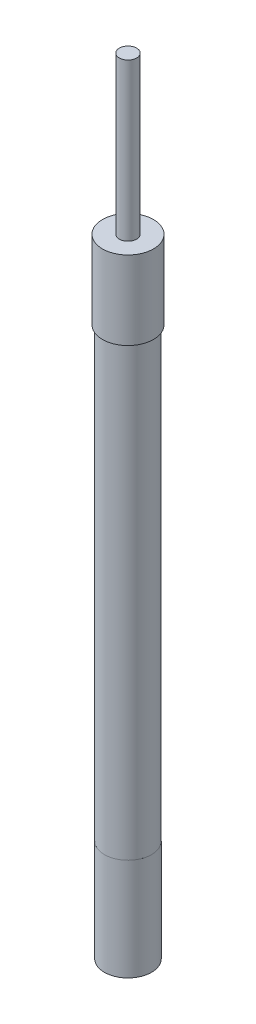
ISO-10303-21;
HEADER;
FILE_DESCRIPTION(('STEP AP214'),'2;1');
FILE_NAME('part.step','',(''),(''),'','','');
FILE_SCHEMA(('AUTOMOTIVE_DESIGN { 1 0 10303 214 1 1 1 1 }'));
ENDSEC;
DATA;
#1=APPLICATION_CONTEXT('core data for automotive mechanical design processes');
#2=APPLICATION_PROTOCOL_DEFINITION('international standard','automotive_design',2000,#1);
#3=PRODUCT_CONTEXT('',#1,'mechanical');
#4=PRODUCT('Part','Part','',(#3));
#5=PRODUCT_RELATED_PRODUCT_CATEGORY('part','',(#4));
#6=PRODUCT_DEFINITION_FORMATION('','',#4);
#7=PRODUCT_DEFINITION_CONTEXT('part definition',#1,'design');
#8=PRODUCT_DEFINITION('design','',#6,#7);
#9=PRODUCT_DEFINITION_SHAPE('','',#8);
#10=(LENGTH_UNIT() NAMED_UNIT(*) SI_UNIT(.MILLI.,.METRE.));
#11=(NAMED_UNIT(*) PLANE_ANGLE_UNIT() SI_UNIT($,.RADIAN.));
#12=(NAMED_UNIT(*) SI_UNIT($,.STERADIAN.) SOLID_ANGLE_UNIT());
#13=UNCERTAINTY_MEASURE_WITH_UNIT(LENGTH_MEASURE(1.E-05),#10,'distance_accuracy_value','');
#14=(GEOMETRIC_REPRESENTATION_CONTEXT(3) GLOBAL_UNCERTAINTY_ASSIGNED_CONTEXT((#13)) GLOBAL_UNIT_ASSIGNED_CONTEXT((#10,
#11,#12)) REPRESENTATION_CONTEXT('',''));
#15=CARTESIAN_POINT('',(0.,0.,0.));
#16=DIRECTION('',(0.,0.,1.));
#17=DIRECTION('',(1.,0.,0.));
#18=AXIS2_PLACEMENT_3D('',#15,#16,#17);
#19=CARTESIAN_POINT('',(0.,200.,0.));
#20=DIRECTION('',(0.,-1.,0.));
#21=DIRECTION('',(0.,0.,-1.));
#22=AXIS2_PLACEMENT_3D('',#19,#20,#21);
#23=CYLINDRICAL_SURFACE('',#22,2.2);
#24=CARTESIAN_POINT('',(0.,200.,0.));
#25=DIRECTION('',(0.,1.,0.));
#26=DIRECTION('',(0.,0.,1.));
#27=AXIS2_PLACEMENT_3D('',#24,#25,#26);
#28=CIRCLE('',#27,2.2);
#29=CARTESIAN_POINT('',(0.,200.,2.2));
#30=VERTEX_POINT('',#29);
#31=EDGE_CURVE('E11',#30,#30,#28,.T.);
#32=ORIENTED_EDGE('',*,*,#31,.F.);
#33=EDGE_LOOP('',(#32));
#34=FACE_BOUND('',#33,.T.);
#35=CARTESIAN_POINT('',(0.,160.,0.));
#36=DIRECTION('',(0.,1.,0.));
#37=DIRECTION('',(0.,0.,1.));
#38=AXIS2_PLACEMENT_3D('',#35,#36,#37);
#39=CIRCLE('',#38,2.2);
#40=CARTESIAN_POINT('',(0.,160.,2.2));
#41=VERTEX_POINT('',#40);
#42=EDGE_CURVE('E60',#41,#41,#39,.T.);
#43=ORIENTED_EDGE('',*,*,#42,.T.);
#44=EDGE_LOOP('',(#43));
#45=FACE_BOUND('',#44,.T.);
#46=ADVANCED_FACE('F53',(#34,#45),#23,.T.);
#47=CARTESIAN_POINT('',(0.,200.,0.));
#48=DIRECTION('',(0.,1.,0.));
#49=DIRECTION('',(0.,0.,1.));
#50=AXIS2_PLACEMENT_3D('',#47,#48,#49);
#51=PLANE('',#50);
#52=ORIENTED_EDGE('',*,*,#31,.T.);
#53=EDGE_LOOP('',(#52));
#54=FACE_BOUND('',#53,.T.);
#55=ADVANCED_FACE('F69',(#54),#51,.T.);
#56=CARTESIAN_POINT('',(0.,160.,0.));
#57=DIRECTION('',(0.,1.,0.));
#58=DIRECTION('',(0.,0.,1.));
#59=AXIS2_PLACEMENT_3D('',#56,#57,#58);
#60=PLANE('',#59);
#61=ORIENTED_EDGE('',*,*,#42,.F.);
#62=EDGE_LOOP('',(#61));
#63=FACE_BOUND('',#62,.T.);
#64=ADVANCED_FACE('F70',(#63),#60,.F.);
#65=CLOSED_SHELL('',(#46,#55,#64));
#66=MANIFOLD_SOLID_BREP('B2',#65);
#67=CARTESIAN_POINT('',(0.,160.,0.));
#68=DIRECTION('',(0.,-1.,0.));
#69=DIRECTION('',(0.,0.,-1.));
#70=AXIS2_PLACEMENT_3D('',#67,#68,#69);
#71=CYLINDRICAL_SURFACE('',#70,6.5);
#72=CARTESIAN_POINT('',(0.,160.,0.));
#73=DIRECTION('',(0.,1.,0.));
#74=DIRECTION('',(0.,0.,1.));
#75=AXIS2_PLACEMENT_3D('',#72,#73,#74);
#76=CIRCLE('',#75,6.5);
#77=CARTESIAN_POINT('',(0.,160.,6.5));
#78=VERTEX_POINT('',#77);
#79=EDGE_CURVE('E52',#78,#78,#76,.T.);
#80=ORIENTED_EDGE('',*,*,#79,.F.);
#81=EDGE_LOOP('',(#80));
#82=FACE_BOUND('',#81,.T.);
#83=CARTESIAN_POINT('',(0.,140.,0.));
#84=DIRECTION('',(0.,1.,0.));
#85=DIRECTION('',(0.,0.,1.));
#86=AXIS2_PLACEMENT_3D('',#83,#84,#85);
#87=CIRCLE('',#86,6.5);
#88=CARTESIAN_POINT('',(0.,140.,6.5));
#89=VERTEX_POINT('',#88);
#90=EDGE_CURVE('E119',#89,#89,#87,.T.);
#91=ORIENTED_EDGE('',*,*,#90,.T.);
#92=EDGE_LOOP('',(#91));
#93=FACE_BOUND('',#92,.T.);
#94=ADVANCED_FACE('F113',(#82,#93),#71,.T.);
#95=CARTESIAN_POINT('',(0.,160.,0.));
#96=DIRECTION('',(0.,1.,0.));
#97=DIRECTION('',(0.,0.,1.));
#98=AXIS2_PLACEMENT_3D('',#95,#96,#97);
#99=PLANE('',#98);
#100=ORIENTED_EDGE('',*,*,#79,.T.);
#101=EDGE_LOOP('',(#100));
#102=FACE_BOUND('',#101,.T.);
#103=ADVANCED_FACE('F128',(#102),#99,.T.);
#104=CARTESIAN_POINT('',(0.,140.,0.));
#105=DIRECTION('',(0.,1.,0.));
#106=DIRECTION('',(0.,0.,1.));
#107=AXIS2_PLACEMENT_3D('',#104,#105,#106);
#108=PLANE('',#107);
#109=ORIENTED_EDGE('',*,*,#90,.F.);
#110=EDGE_LOOP('',(#109));
#111=FACE_BOUND('',#110,.T.);
#112=ADVANCED_FACE('F126',(#111),#108,.F.);
#113=CLOSED_SHELL('',(#94,#103,#112));
#114=MANIFOLD_SOLID_BREP('B6',#113);
#115=CARTESIAN_POINT('',(0.,140.,0.));
#116=DIRECTION('',(0.,-1.,0.));
#117=DIRECTION('',(0.,0.,-1.));
#118=AXIS2_PLACEMENT_3D('',#115,#116,#117);
#119=CYLINDRICAL_SURFACE('',#118,6.);
#120=CARTESIAN_POINT('',(0.,140.,0.));
#121=DIRECTION('',(0.,1.,0.));
#122=DIRECTION('',(0.,0.,1.));
#123=AXIS2_PLACEMENT_3D('',#120,#121,#122);
#124=CIRCLE('',#123,6.);
#125=CARTESIAN_POINT('',(0.,140.,-6.));
#126=VERTEX_POINT('',#125);
#127=EDGE_CURVE('E111',#126,#126,#124,.T.);
#128=CARTESIAN_POINT('',(0.,26.,0.));
#129=DIRECTION('',(0.,1.,0.));
#130=DIRECTION('',(0.,0.,1.));
#131=AXIS2_PLACEMENT_3D('',#128,#129,#130);
#132=CIRCLE('',#131,6.);
#133=CARTESIAN_POINT('',(0.,26.,-6.));
#134=VERTEX_POINT('',#133);
#135=EDGE_CURVE('E178',#134,#134,#132,.T.);
#136=CARTESIAN_POINT('',(0.,140.,-6.));
#137=CARTESIAN_POINT('',(0.,138.8125,-6.));
#138=CARTESIAN_POINT('',(0.,137.625,-6.));
#139=CARTESIAN_POINT('',(0.,135.25,-6.));
#140=CARTESIAN_POINT('',(0.,134.0625,-6.));
#141=CARTESIAN_POINT('',(0.,131.6875,-6.));
#142=CARTESIAN_POINT('',(0.,130.5,-6.));
#143=CARTESIAN_POINT('',(0.,128.125,-6.));
#144=CARTESIAN_POINT('',(0.,126.9375,-6.));
#145=CARTESIAN_POINT('',(0.,124.5625,-6.));
#146=CARTESIAN_POINT('',(0.,123.375,-6.));
#147=CARTESIAN_POINT('',(0.,121.,-6.));
#148=CARTESIAN_POINT('',(0.,119.8125,-6.));
#149=CARTESIAN_POINT('',(0.,117.4375,-6.));
#150=CARTESIAN_POINT('',(0.,116.25,-6.));
#151=CARTESIAN_POINT('',(0.,113.875,-6.));
#152=CARTESIAN_POINT('',(0.,112.6875,-6.));
#153=CARTESIAN_POINT('',(0.,110.3125,-6.));
#154=CARTESIAN_POINT('',(0.,109.125,-6.));
#155=CARTESIAN_POINT('',(0.,106.75,-6.));
#156=CARTESIAN_POINT('',(0.,105.5625,-6.));
#157=CARTESIAN_POINT('',(0.,103.1875,-6.));
#158=CARTESIAN_POINT('',(0.,102.,-6.));
#159=CARTESIAN_POINT('',(0.,99.625,-6.));
#160=CARTESIAN_POINT('',(0.,98.4375,-6.));
#161=CARTESIAN_POINT('',(0.,96.0625,-6.));
#162=CARTESIAN_POINT('',(0.,94.875,-6.));
#163=CARTESIAN_POINT('',(0.,92.5,-6.));
#164=CARTESIAN_POINT('',(0.,91.3125,-6.));
#165=CARTESIAN_POINT('',(0.,88.9375,-6.));
#166=CARTESIAN_POINT('',(0.,87.75,-6.));
#167=CARTESIAN_POINT('',(0.,85.375,-6.));
#168=CARTESIAN_POINT('',(0.,84.1875,-6.));
#169=CARTESIAN_POINT('',(0.,81.8125,-6.));
#170=CARTESIAN_POINT('',(0.,80.625,-6.));
#171=CARTESIAN_POINT('',(0.,78.25,-6.));
#172=CARTESIAN_POINT('',(0.,77.0625,-6.));
#173=CARTESIAN_POINT('',(0.,74.6875,-6.));
#174=CARTESIAN_POINT('',(0.,73.5,-6.));
#175=CARTESIAN_POINT('',(0.,71.125,-6.));
#176=CARTESIAN_POINT('',(0.,69.9375,-6.));
#177=CARTESIAN_POINT('',(0.,67.5625,-6.));
#178=CARTESIAN_POINT('',(0.,66.375,-6.));
#179=CARTESIAN_POINT('',(0.,64.,-6.));
#180=CARTESIAN_POINT('',(0.,62.8125,-6.));
#181=CARTESIAN_POINT('',(0.,60.4375,-6.));
#182=CARTESIAN_POINT('',(0.,59.25,-6.));
#183=CARTESIAN_POINT('',(0.,56.875,-6.));
#184=CARTESIAN_POINT('',(0.,55.6875,-6.));
#185=CARTESIAN_POINT('',(0.,53.3125,-6.));
#186=CARTESIAN_POINT('',(0.,52.125,-6.));
#187=CARTESIAN_POINT('',(0.,49.75,-6.));
#188=CARTESIAN_POINT('',(0.,48.5625,-6.));
#189=CARTESIAN_POINT('',(0.,46.1875,-6.));
#190=CARTESIAN_POINT('',(0.,45.,-6.));
#191=CARTESIAN_POINT('',(0.,42.625,-6.));
#192=CARTESIAN_POINT('',(0.,41.4375,-6.));
#193=CARTESIAN_POINT('',(0.,39.0625,-6.));
#194=CARTESIAN_POINT('',(0.,37.875,-6.));
#195=CARTESIAN_POINT('',(0.,35.5,-6.));
#196=CARTESIAN_POINT('',(0.,34.3125,-6.));
#197=CARTESIAN_POINT('',(0.,31.9375,-6.));
#198=CARTESIAN_POINT('',(0.,30.75,-6.));
#199=CARTESIAN_POINT('',(0.,28.375,-6.));
#200=CARTESIAN_POINT('',(0.,27.1875,-6.));
#201=CARTESIAN_POINT('',(0.,26.,-6.));
#202=B_SPLINE_CURVE_WITH_KNOTS('',3,(#136,#137,#138,#139,#140,#141,#142,#143,#144,#145,#146,
#147,#148,#149,#150,#151,#152,#153,#154,#155,#156,#157,#158,#159,#160,#161,#162,#163,#164,#165,
#166,#167,#168,#169,#170,#171,#172,#173,#174,#175,#176,#177,#178,#179,#180,#181,#182,#183,#184,
#185,#186,#187,#188,#189,#190,#191,#192,#193,#194,#195,#196,#197,#198,#199,#200,#201),
.UNSPECIFIED.,.F.,.F.,(4,2,2,2,2,2,2,2,2,2,2,2,2,2,2,2,2,2,2,2,2,2,2,2,2,2,2,2,2,2,2,2,4),(0.,
3.5625,7.12499999999999,10.6875,14.25,17.8125,21.375,24.9375,28.5,32.0625,35.625,39.1875,42.75,
46.3125,49.875,53.4375,57.,60.5625,64.125,67.6875,71.25,74.8125,78.375,81.9375,85.5,89.0625,
92.625,96.1875,99.75,103.3125,106.875,110.4375,114.),.UNSPECIFIED.);
#203=EDGE_CURVE('BSEAM173',#126,#134,#202,.T.);
#204=ORIENTED_EDGE('',*,*,#127,.F.);
#205=ORIENTED_EDGE('',*,*,#135,.T.);
#206=ORIENTED_EDGE('',*,*,#203,.T.);
#207=ORIENTED_EDGE('',*,*,#203,.F.);
#208=EDGE_LOOP('',(#204,#206,#205,#207));
#209=FACE_BOUND('',#208,.T.);
#210=ADVANCED_FACE('F173',(#209),#119,.T.);
#211=CARTESIAN_POINT('',(0.,140.,0.));
#212=DIRECTION('',(0.,1.,0.));
#213=DIRECTION('',(0.,0.,1.));
#214=AXIS2_PLACEMENT_3D('',#211,#212,#213);
#215=PLANE('',#214);
#216=ORIENTED_EDGE('',*,*,#127,.T.);
#217=EDGE_LOOP('',(#216));
#218=FACE_BOUND('',#217,.T.);
#219=ADVANCED_FACE('F188',(#218),#215,.T.);
#220=CARTESIAN_POINT('',(0.,26.,0.));
#221=DIRECTION('',(0.,1.,0.));
#222=DIRECTION('',(0.,0.,1.));
#223=AXIS2_PLACEMENT_3D('',#220,#221,#222);
#224=PLANE('',#223);
#225=ORIENTED_EDGE('',*,*,#135,.F.);
#226=EDGE_LOOP('',(#225));
#227=FACE_BOUND('',#226,.T.);
#228=ADVANCED_FACE('F189',(#227),#224,.F.);
#229=CLOSED_SHELL('',(#210,#219,#228));
#230=MANIFOLD_SOLID_BREP('B48',#229);
#231=CARTESIAN_POINT('',(0.,26.,0.));
#232=DIRECTION('',(0.,-1.,0.));
#233=DIRECTION('',(0.,0.,-1.));
#234=AXIS2_PLACEMENT_3D('',#231,#232,#233);
#235=CYLINDRICAL_SURFACE('',#234,6.);
#236=CARTESIAN_POINT('',(0.,26.,0.));
#237=DIRECTION('',(0.,1.,0.));
#238=DIRECTION('',(0.,0.,1.));
#239=AXIS2_PLACEMENT_3D('',#236,#237,#238);
#240=CIRCLE('',#239,6.);
#241=CARTESIAN_POINT('',(0.,26.,6.));
#242=VERTEX_POINT('',#241);
#243=EDGE_CURVE('E171',#242,#242,#240,.T.);
#244=ORIENTED_EDGE('',*,*,#243,.F.);
#245=EDGE_LOOP('',(#244));
#246=FACE_BOUND('',#245,.T.);
#247=CARTESIAN_POINT('',(0.,0.,0.));
#248=DIRECTION('',(0.,1.,0.));
#249=DIRECTION('',(0.,0.,1.));
#250=AXIS2_PLACEMENT_3D('',#247,#248,#249);
#251=CIRCLE('',#250,6.);
#252=CARTESIAN_POINT('',(0.,0.,6.));
#253=VERTEX_POINT('',#252);
#254=EDGE_CURVE('E232',#253,#253,#251,.T.);
#255=ORIENTED_EDGE('',*,*,#254,.T.);
#256=EDGE_LOOP('',(#255));
#257=FACE_BOUND('',#256,.T.);
#258=ADVANCED_FACE('F229',(#246,#257),#235,.T.);
#259=CARTESIAN_POINT('',(0.,26.,0.));
#260=DIRECTION('',(0.,1.,0.));
#261=DIRECTION('',(0.,0.,1.));
#262=AXIS2_PLACEMENT_3D('',#259,#260,#261);
#263=PLANE('',#262);
#264=ORIENTED_EDGE('',*,*,#243,.T.);
#265=EDGE_LOOP('',(#264));
#266=FACE_BOUND('',#265,.T.);
#267=ADVANCED_FACE('F244',(#266),#263,.T.);
#268=CARTESIAN_POINT('',(0.,0.,0.));
#269=DIRECTION('',(0.,1.,0.));
#270=DIRECTION('',(0.,0.,1.));
#271=AXIS2_PLACEMENT_3D('',#268,#269,#270);
#272=PLANE('',#271);
#273=ORIENTED_EDGE('',*,*,#254,.F.);
#274=EDGE_LOOP('',(#273));
#275=FACE_BOUND('',#274,.T.);
#276=ADVANCED_FACE('F242',(#275),#272,.F.);
#277=CLOSED_SHELL('',(#258,#267,#276));
#278=MANIFOLD_SOLID_BREP('B108',#277);
#279=ADVANCED_BREP_SHAPE_REPRESENTATION('',(#18,#66,#114,#230,#278),#14);
#280=SHAPE_DEFINITION_REPRESENTATION(#9,#279);
ENDSEC;
END-ISO-10303-21;
